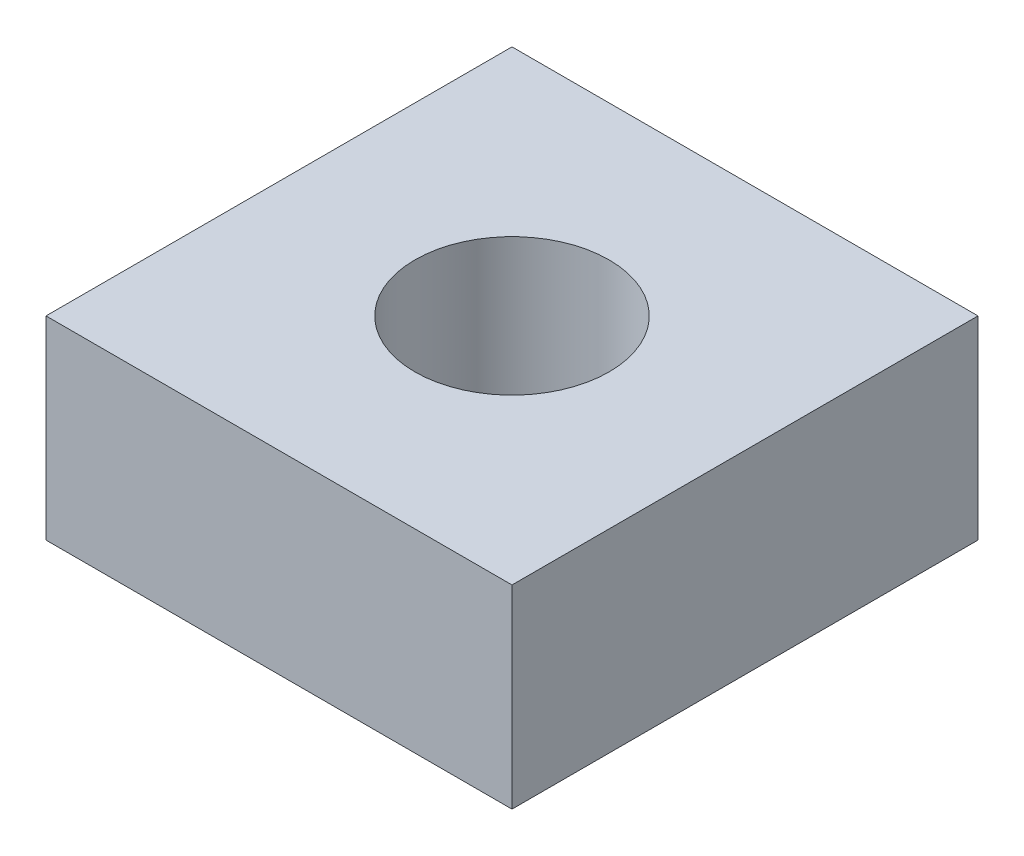
ISO-10303-21;
HEADER;
FILE_DESCRIPTION(('STEP AP214'),'2;1');
FILE_NAME('part.step','',(''),(''),'','','');
FILE_SCHEMA(('AUTOMOTIVE_DESIGN { 1 0 10303 214 1 1 1 1 }'));
ENDSEC;
DATA;
#1=APPLICATION_CONTEXT('core data for automotive mechanical design processes');
#2=APPLICATION_PROTOCOL_DEFINITION('international standard','automotive_design',2000,#1);
#3=PRODUCT_CONTEXT('',#1,'mechanical');
#4=PRODUCT('Part','Part','',(#3));
#5=PRODUCT_RELATED_PRODUCT_CATEGORY('part','',(#4));
#6=PRODUCT_DEFINITION_FORMATION('','',#4);
#7=PRODUCT_DEFINITION_CONTEXT('part definition',#1,'design');
#8=PRODUCT_DEFINITION('design','',#6,#7);
#9=PRODUCT_DEFINITION_SHAPE('','',#8);
#10=(LENGTH_UNIT() NAMED_UNIT(*) SI_UNIT(.MILLI.,.METRE.));
#11=(NAMED_UNIT(*) PLANE_ANGLE_UNIT() SI_UNIT($,.RADIAN.));
#12=(NAMED_UNIT(*) SI_UNIT($,.STERADIAN.) SOLID_ANGLE_UNIT());
#13=UNCERTAINTY_MEASURE_WITH_UNIT(LENGTH_MEASURE(1.E-05),#10,'distance_accuracy_value','');
#14=(GEOMETRIC_REPRESENTATION_CONTEXT(3) GLOBAL_UNCERTAINTY_ASSIGNED_CONTEXT((#13)) GLOBAL_UNIT_ASSIGNED_CONTEXT((#10,
#11,#12)) REPRESENTATION_CONTEXT('',''));
#15=CARTESIAN_POINT('',(0.,0.,0.));
#16=DIRECTION('',(0.,0.,1.));
#17=DIRECTION('',(1.,0.,0.));
#18=AXIS2_PLACEMENT_3D('',#15,#16,#17);
#19=CARTESIAN_POINT('',(60.,-50.,-60.));
#20=DIRECTION('',(1.,0.,0.));
#21=DIRECTION('',(0.,0.,-1.));
#22=AXIS2_PLACEMENT_3D('',#19,#20,#21);
#23=PLANE('',#22);
#24=DIRECTION('',(0.,0.,-1.));
#25=VECTOR('',#24,1.);
#26=CARTESIAN_POINT('',(60.,0.,-60.));
#27=LINE('',#26,#25);
#28=CARTESIAN_POINT('',(60.,0.,60.));
#29=VERTEX_POINT('',#28);
#30=CARTESIAN_POINT('',(60.,0.,-60.));
#31=VERTEX_POINT('',#30);
#32=EDGE_CURVE('E100',#29,#31,#27,.T.);
#33=ORIENTED_EDGE('',*,*,#32,.F.);
#34=DIRECTION('',(0.,1.,0.));
#35=VECTOR('',#34,1.);
#36=CARTESIAN_POINT('',(60.,-50.,60.));
#37=LINE('',#36,#35);
#38=CARTESIAN_POINT('',(60.,-50.,60.));
#39=VERTEX_POINT('',#38);
#40=EDGE_CURVE('E11',#39,#29,#37,.T.);
#41=ORIENTED_EDGE('',*,*,#40,.F.);
#42=DIRECTION('',(0.,0.,-1.));
#43=VECTOR('',#42,1.);
#44=CARTESIAN_POINT('',(60.,-50.,-60.));
#45=LINE('',#44,#43);
#46=CARTESIAN_POINT('',(60.,-50.,-60.));
#47=VERTEX_POINT('',#46);
#48=EDGE_CURVE('E93',#39,#47,#45,.T.);
#49=ORIENTED_EDGE('',*,*,#48,.T.);
#50=DIRECTION('',(0.,1.,0.));
#51=VECTOR('',#50,1.);
#52=CARTESIAN_POINT('',(60.,-50.,-60.));
#53=LINE('',#52,#51);
#54=EDGE_CURVE('E38',#47,#31,#53,.T.);
#55=ORIENTED_EDGE('',*,*,#54,.T.);
#56=EDGE_LOOP('',(#33,#41,#49,#55));
#57=FACE_BOUND('',#56,.T.);
#58=ADVANCED_FACE('F35',(#57),#23,.T.);
#59=CARTESIAN_POINT('',(-60.,-50.,60.));
#60=DIRECTION('',(0.,0.,1.));
#61=DIRECTION('',(1.,0.,0.));
#62=AXIS2_PLACEMENT_3D('',#59,#60,#61);
#63=PLANE('',#62);
#64=DIRECTION('',(1.,0.,0.));
#65=VECTOR('',#64,1.);
#66=CARTESIAN_POINT('',(-60.,0.,60.));
#67=LINE('',#66,#65);
#68=CARTESIAN_POINT('',(-60.,0.,60.));
#69=VERTEX_POINT('',#68);
#70=EDGE_CURVE('E95',#69,#29,#67,.T.);
#71=ORIENTED_EDGE('',*,*,#70,.F.);
#72=DIRECTION('',(0.,1.,0.));
#73=VECTOR('',#72,1.);
#74=CARTESIAN_POINT('',(-60.,-50.,60.));
#75=LINE('',#74,#73);
#76=CARTESIAN_POINT('',(-60.,-50.,60.));
#77=VERTEX_POINT('',#76);
#78=EDGE_CURVE('E44',#77,#69,#75,.T.);
#79=ORIENTED_EDGE('',*,*,#78,.F.);
#80=DIRECTION('',(1.,0.,0.));
#81=VECTOR('',#80,1.);
#82=CARTESIAN_POINT('',(-60.,-50.,60.));
#83=LINE('',#82,#81);
#84=EDGE_CURVE('E90',#77,#39,#83,.T.);
#85=ORIENTED_EDGE('',*,*,#84,.T.);
#86=ORIENTED_EDGE('',*,*,#40,.T.);
#87=EDGE_LOOP('',(#71,#79,#85,#86));
#88=FACE_BOUND('',#87,.T.);
#89=ADVANCED_FACE('F111',(#88),#63,.T.);
#90=CARTESIAN_POINT('',(-60.,-50.,-60.));
#91=DIRECTION('',(-1.,0.,0.));
#92=DIRECTION('',(0.,0.,1.));
#93=AXIS2_PLACEMENT_3D('',#90,#91,#92);
#94=PLANE('',#93);
#95=DIRECTION('',(0.,0.,1.));
#96=VECTOR('',#95,1.);
#97=CARTESIAN_POINT('',(-60.,0.,-60.));
#98=LINE('',#97,#96);
#99=CARTESIAN_POINT('',(-60.,0.,-60.));
#100=VERTEX_POINT('',#99);
#101=EDGE_CURVE('E85',#100,#69,#98,.T.);
#102=ORIENTED_EDGE('',*,*,#101,.F.);
#103=DIRECTION('',(0.,1.,0.));
#104=VECTOR('',#103,1.);
#105=CARTESIAN_POINT('',(-60.,-50.,-60.));
#106=LINE('',#105,#104);
#107=CARTESIAN_POINT('',(-60.,-50.,-60.));
#108=VERTEX_POINT('',#107);
#109=EDGE_CURVE('E80',#108,#100,#106,.T.);
#110=ORIENTED_EDGE('',*,*,#109,.F.);
#111=DIRECTION('',(0.,0.,1.));
#112=VECTOR('',#111,1.);
#113=CARTESIAN_POINT('',(-60.,-50.,-60.));
#114=LINE('',#113,#112);
#115=EDGE_CURVE('E83',#108,#77,#114,.T.);
#116=ORIENTED_EDGE('',*,*,#115,.T.);
#117=ORIENTED_EDGE('',*,*,#78,.T.);
#118=EDGE_LOOP('',(#102,#110,#116,#117));
#119=FACE_BOUND('',#118,.T.);
#120=ADVANCED_FACE('F82',(#119),#94,.T.);
#121=CARTESIAN_POINT('',(-60.,-50.,-60.));
#122=DIRECTION('',(0.,0.,-1.));
#123=DIRECTION('',(-1.,0.,0.));
#124=AXIS2_PLACEMENT_3D('',#121,#122,#123);
#125=PLANE('',#124);
#126=DIRECTION('',(-1.,0.,0.));
#127=VECTOR('',#126,1.);
#128=CARTESIAN_POINT('',(-60.,0.,-60.));
#129=LINE('',#128,#127);
#130=EDGE_CURVE('E103',#31,#100,#129,.T.);
#131=ORIENTED_EDGE('',*,*,#130,.F.);
#132=ORIENTED_EDGE('',*,*,#54,.F.);
#133=DIRECTION('',(-1.,0.,0.));
#134=VECTOR('',#133,1.);
#135=CARTESIAN_POINT('',(-60.,-50.,-60.));
#136=LINE('',#135,#134);
#137=EDGE_CURVE('E89',#47,#108,#136,.T.);
#138=ORIENTED_EDGE('',*,*,#137,.T.);
#139=ORIENTED_EDGE('',*,*,#109,.T.);
#140=EDGE_LOOP('',(#131,#132,#138,#139));
#141=FACE_BOUND('',#140,.T.);
#142=ADVANCED_FACE('F92',(#141),#125,.T.);
#143=CARTESIAN_POINT('',(0.,-50.,0.));
#144=DIRECTION('',(0.,1.,0.));
#145=DIRECTION('',(0.,0.,1.));
#146=AXIS2_PLACEMENT_3D('',#143,#144,#145);
#147=PLANE('',#146);
#148=CARTESIAN_POINT('',(0.,-50.,0.));
#149=DIRECTION('',(0.,1.,0.));
#150=DIRECTION('',(0.,0.,1.));
#151=AXIS2_PLACEMENT_3D('',#148,#149,#150);
#152=CIRCLE('',#151,25.);
#153=CARTESIAN_POINT('',(0.,-50.,25.));
#154=VERTEX_POINT('',#153);
#155=EDGE_CURVE('E104',#154,#154,#152,.T.);
#156=ORIENTED_EDGE('',*,*,#155,.T.);
#157=EDGE_LOOP('',(#156));
#158=FACE_BOUND('',#157,.T.);
#159=ORIENTED_EDGE('',*,*,#48,.F.);
#160=ORIENTED_EDGE('',*,*,#84,.F.);
#161=ORIENTED_EDGE('',*,*,#115,.F.);
#162=ORIENTED_EDGE('',*,*,#137,.F.);
#163=EDGE_LOOP('',(#159,#160,#161,#162));
#164=FACE_BOUND('',#163,.T.);
#165=ADVANCED_FACE('F88',(#158,#164),#147,.F.);
#166=CARTESIAN_POINT('',(0.,0.,0.));
#167=DIRECTION('',(0.,1.,0.));
#168=DIRECTION('',(0.,0.,1.));
#169=AXIS2_PLACEMENT_3D('',#166,#167,#168);
#170=PLANE('',#169);
#171=CARTESIAN_POINT('',(0.,0.,0.));
#172=DIRECTION('',(0.,1.,0.));
#173=DIRECTION('',(0.,0.,1.));
#174=AXIS2_PLACEMENT_3D('',#171,#172,#173);
#175=CIRCLE('',#174,25.);
#176=CARTESIAN_POINT('',(0.,0.,25.));
#177=VERTEX_POINT('',#176);
#178=EDGE_CURVE('E141',#177,#177,#175,.T.);
#179=ORIENTED_EDGE('',*,*,#178,.F.);
#180=EDGE_LOOP('',(#179));
#181=FACE_BOUND('',#180,.T.);
#182=ORIENTED_EDGE('',*,*,#32,.T.);
#183=ORIENTED_EDGE('',*,*,#130,.T.);
#184=ORIENTED_EDGE('',*,*,#101,.T.);
#185=ORIENTED_EDGE('',*,*,#70,.T.);
#186=EDGE_LOOP('',(#182,#183,#184,#185));
#187=FACE_BOUND('',#186,.T.);
#188=ADVANCED_FACE('F110',(#181,#187),#170,.T.);
#189=CARTESIAN_POINT('',(0.,-50.,0.));
#190=DIRECTION('',(0.,1.,0.));
#191=DIRECTION('',(0.,0.,1.));
#192=AXIS2_PLACEMENT_3D('',#189,#190,#191);
#193=CYLINDRICAL_SURFACE('',#192,25.);
#194=ORIENTED_EDGE('',*,*,#155,.F.);
#195=EDGE_LOOP('',(#194));
#196=FACE_BOUND('',#195,.T.);
#197=ORIENTED_EDGE('',*,*,#178,.T.);
#198=EDGE_LOOP('',(#197));
#199=FACE_BOUND('',#198,.T.);
#200=ADVANCED_FACE('F129',(#196,#199),#193,.F.);
#201=CLOSED_SHELL('',(#58,#89,#120,#142,#165,#188,#200));
#202=MANIFOLD_SOLID_BREP('B2',#201);
#203=ADVANCED_BREP_SHAPE_REPRESENTATION('',(#18,#202),#14);
#204=SHAPE_DEFINITION_REPRESENTATION(#9,#203);
ENDSEC;
END-ISO-10303-21;
